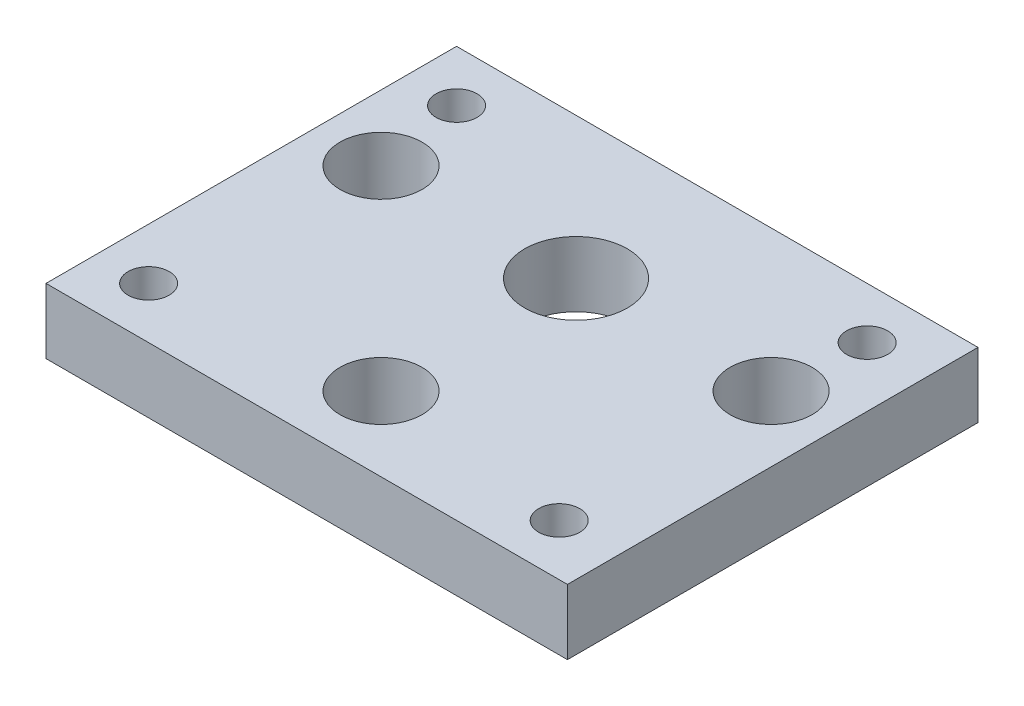
ISO-10303-21;
HEADER;
FILE_DESCRIPTION(('STEP AP214'),'2;1');
FILE_NAME('part.step','',(''),(''),'','','');
FILE_SCHEMA(('AUTOMOTIVE_DESIGN { 1 0 10303 214 1 1 1 1 }'));
ENDSEC;
DATA;
#1=APPLICATION_CONTEXT('core data for automotive mechanical design processes');
#2=APPLICATION_PROTOCOL_DEFINITION('international standard','automotive_design',2000,#1);
#3=PRODUCT_CONTEXT('',#1,'mechanical');
#4=PRODUCT('Part','Part','',(#3));
#5=PRODUCT_RELATED_PRODUCT_CATEGORY('part','',(#4));
#6=PRODUCT_DEFINITION_FORMATION('','',#4);
#7=PRODUCT_DEFINITION_CONTEXT('part definition',#1,'design');
#8=PRODUCT_DEFINITION('design','',#6,#7);
#9=PRODUCT_DEFINITION_SHAPE('','',#8);
#10=(LENGTH_UNIT() NAMED_UNIT(*) SI_UNIT(.MILLI.,.METRE.));
#11=(NAMED_UNIT(*) PLANE_ANGLE_UNIT() SI_UNIT($,.RADIAN.));
#12=(NAMED_UNIT(*) SI_UNIT($,.STERADIAN.) SOLID_ANGLE_UNIT());
#13=UNCERTAINTY_MEASURE_WITH_UNIT(LENGTH_MEASURE(1.E-05),#10,'distance_accuracy_value','');
#14=(GEOMETRIC_REPRESENTATION_CONTEXT(3) GLOBAL_UNCERTAINTY_ASSIGNED_CONTEXT((#13)) GLOBAL_UNIT_ASSIGNED_CONTEXT((#10,
#11,#12)) REPRESENTATION_CONTEXT('',''));
#15=CARTESIAN_POINT('',(0.,0.,0.));
#16=DIRECTION('',(0.,0.,1.));
#17=DIRECTION('',(1.,0.,0.));
#18=AXIS2_PLACEMENT_3D('',#15,#16,#17);
#19=CARTESIAN_POINT('',(25.4,6.35,-40.));
#20=DIRECTION('',(-1.,0.,0.));
#21=DIRECTION('',(0.,0.,1.));
#22=AXIS2_PLACEMENT_3D('',#19,#20,#21);
#23=PLANE('',#22);
#24=DIRECTION('',(0.,-1.,0.));
#25=VECTOR('',#24,1.);
#26=CARTESIAN_POINT('',(25.4,10.,-33.2265724491529));
#27=LINE('',#26,#25);
#28=CARTESIAN_POINT('',(25.4,6.35,-33.2265724491529));
#29=VERTEX_POINT('',#28);
#30=CARTESIAN_POINT('',(25.4,0.,-33.2265724491529));
#31=VERTEX_POINT('',#30);
#32=EDGE_CURVE('E49',#29,#31,#27,.T.);
#33=ORIENTED_EDGE('',*,*,#32,.F.);
#34=DIRECTION('',(0.,0.,-1.));
#35=VECTOR('',#34,1.);
#36=CARTESIAN_POINT('',(25.4,6.35,-40.));
#37=LINE('',#36,#35);
#38=CARTESIAN_POINT('',(25.4,6.35,6.77342755084709));
#39=VERTEX_POINT('',#38);
#40=EDGE_CURVE('E87',#39,#29,#37,.T.);
#41=ORIENTED_EDGE('',*,*,#40,.F.);
#42=DIRECTION('',(0.,1.,0.));
#43=VECTOR('',#42,1.);
#44=CARTESIAN_POINT('',(25.4,-3.65,6.77342755084709));
#45=LINE('',#44,#43);
#46=CARTESIAN_POINT('',(25.4,0.,6.77342755084709));
#47=VERTEX_POINT('',#46);
#48=EDGE_CURVE('E113',#47,#39,#45,.T.);
#49=ORIENTED_EDGE('',*,*,#48,.F.);
#50=DIRECTION('',(0.,0.,-1.));
#51=VECTOR('',#50,1.);
#52=CARTESIAN_POINT('',(25.4,0.,-40.));
#53=LINE('',#52,#51);
#54=EDGE_CURVE('E88',#47,#31,#53,.T.);
#55=ORIENTED_EDGE('',*,*,#54,.T.);
#56=EDGE_LOOP('',(#33,#41,#49,#55));
#57=FACE_BOUND('',#56,.T.);
#58=ADVANCED_FACE('F35',(#57),#23,.F.);
#59=CARTESIAN_POINT('',(-25.4,6.35,-40.));
#60=DIRECTION('',(1.,0.,0.));
#61=DIRECTION('',(0.,0.,-1.));
#62=AXIS2_PLACEMENT_3D('',#59,#60,#61);
#63=PLANE('',#62);
#64=DIRECTION('',(0.,-1.,0.));
#65=VECTOR('',#64,1.);
#66=CARTESIAN_POINT('',(-25.4,10.,-33.2265724491529));
#67=LINE('',#66,#65);
#68=CARTESIAN_POINT('',(-25.4,6.35,-33.2265724491529));
#69=VERTEX_POINT('',#68);
#70=CARTESIAN_POINT('',(-25.4,0.,-33.2265724491529));
#71=VERTEX_POINT('',#70);
#72=EDGE_CURVE('E76',#69,#71,#67,.T.);
#73=ORIENTED_EDGE('',*,*,#72,.T.);
#74=DIRECTION('',(0.,0.,1.));
#75=VECTOR('',#74,1.);
#76=CARTESIAN_POINT('',(-25.4,0.,-40.));
#77=LINE('',#76,#75);
#78=CARTESIAN_POINT('',(-25.4,0.,6.77342755084709));
#79=VERTEX_POINT('',#78);
#80=EDGE_CURVE('E57',#71,#79,#77,.T.);
#81=ORIENTED_EDGE('',*,*,#80,.T.);
#82=DIRECTION('',(0.,1.,0.));
#83=VECTOR('',#82,1.);
#84=CARTESIAN_POINT('',(-25.4,-3.65,6.77342755084709));
#85=LINE('',#84,#83);
#86=CARTESIAN_POINT('',(-25.4,6.35,6.77342755084709));
#87=VERTEX_POINT('',#86);
#88=EDGE_CURVE('E105',#79,#87,#85,.T.);
#89=ORIENTED_EDGE('',*,*,#88,.T.);
#90=DIRECTION('',(0.,0.,1.));
#91=VECTOR('',#90,1.);
#92=CARTESIAN_POINT('',(-25.4,6.35,-40.));
#93=LINE('',#92,#91);
#94=EDGE_CURVE('E42',#69,#87,#93,.T.);
#95=ORIENTED_EDGE('',*,*,#94,.F.);
#96=EDGE_LOOP('',(#73,#81,#89,#95));
#97=FACE_BOUND('',#96,.T.);
#98=ADVANCED_FACE('F84',(#97),#63,.F.);
#99=CARTESIAN_POINT('',(0.,6.35,0.));
#100=DIRECTION('',(0.,1.,0.));
#101=DIRECTION('',(0.,0.,1.));
#102=AXIS2_PLACEMENT_3D('',#99,#100,#101);
#103=PLANE('',#102);
#104=CARTESIAN_POINT('',(19.6,6.35,1.77342755084709));
#105=DIRECTION('',(0.,1.,0.));
#106=DIRECTION('',(0.,0.,1.));
#107=AXIS2_PLACEMENT_3D('',#104,#105,#106);
#108=CIRCLE('',#107,2.);
#109=CARTESIAN_POINT('',(19.6,6.35,3.77342755084709));
#110=VERTEX_POINT('',#109);
#111=EDGE_CURVE('E133',#110,#110,#108,.T.);
#112=ORIENTED_EDGE('',*,*,#111,.F.);
#113=EDGE_LOOP('',(#112));
#114=FACE_BOUND('',#113,.T.);
#115=CARTESIAN_POINT('',(19.6000000000003,6.35,-28.2265724491529));
#116=DIRECTION('',(0.,1.,0.));
#117=DIRECTION('',(0.,0.,1.));
#118=AXIS2_PLACEMENT_3D('',#115,#116,#117);
#119=CIRCLE('',#118,2.);
#120=CARTESIAN_POINT('',(19.6000000000003,6.35,-26.2265724491529));
#121=VERTEX_POINT('',#120);
#122=EDGE_CURVE('E136',#121,#121,#119,.T.);
#123=ORIENTED_EDGE('',*,*,#122,.F.);
#124=EDGE_LOOP('',(#123));
#125=FACE_BOUND('',#124,.T.);
#126=CARTESIAN_POINT('',(-20.3999999999997,6.35,-28.2265724491529));
#127=DIRECTION('',(0.,1.,0.));
#128=DIRECTION('',(0.,0.,1.));
#129=AXIS2_PLACEMENT_3D('',#126,#127,#128);
#130=CIRCLE('',#129,2.);
#131=CARTESIAN_POINT('',(-20.3999999999997,6.35,-26.2265724491529));
#132=VERTEX_POINT('',#131);
#133=EDGE_CURVE('E139',#132,#132,#130,.T.);
#134=ORIENTED_EDGE('',*,*,#133,.F.);
#135=EDGE_LOOP('',(#134));
#136=FACE_BOUND('',#135,.T.);
#137=CARTESIAN_POINT('',(-20.4,6.35,1.77342755084709));
#138=DIRECTION('',(0.,1.,0.));
#139=DIRECTION('',(0.,0.,1.));
#140=AXIS2_PLACEMENT_3D('',#137,#138,#139);
#141=CIRCLE('',#140,2.);
#142=CARTESIAN_POINT('',(-20.4,6.35,3.77342755084709));
#143=VERTEX_POINT('',#142);
#144=EDGE_CURVE('E127',#143,#143,#141,.T.);
#145=ORIENTED_EDGE('',*,*,#144,.F.);
#146=EDGE_LOOP('',(#145));
#147=FACE_BOUND('',#146,.T.);
#148=CARTESIAN_POINT('',(0.,6.35,-19.4660918494586));
#149=DIRECTION('',(0.,1.,0.));
#150=DIRECTION('',(0.,0.,1.));
#151=AXIS2_PLACEMENT_3D('',#148,#149,#150);
#152=CIRCLE('',#151,5.);
#153=CARTESIAN_POINT('',(0.,6.35,-14.4660918494586));
#154=VERTEX_POINT('',#153);
#155=EDGE_CURVE('E81',#154,#154,#152,.T.);
#156=ORIENTED_EDGE('',*,*,#155,.F.);
#157=EDGE_LOOP('',(#156));
#158=FACE_BOUND('',#157,.T.);
#159=CARTESIAN_POINT('',(19.,6.35,-19.4660918494586));
#160=DIRECTION('',(0.,1.,0.));
#161=DIRECTION('',(0.,0.,1.));
#162=AXIS2_PLACEMENT_3D('',#159,#160,#161);
#163=CIRCLE('',#162,4.);
#164=CARTESIAN_POINT('',(19.,6.35,-15.4660918494586));
#165=VERTEX_POINT('',#164);
#166=EDGE_CURVE('E108',#165,#165,#163,.T.);
#167=ORIENTED_EDGE('',*,*,#166,.F.);
#168=EDGE_LOOP('',(#167));
#169=FACE_BOUND('',#168,.T.);
#170=CARTESIAN_POINT('',(0.,6.35,-0.466091849458573));
#171=DIRECTION('',(0.,1.,0.));
#172=DIRECTION('',(0.,0.,1.));
#173=AXIS2_PLACEMENT_3D('',#170,#171,#172);
#174=CIRCLE('',#173,4.);
#175=CARTESIAN_POINT('',(0.,6.35,3.53390815054143));
#176=VERTEX_POINT('',#175);
#177=EDGE_CURVE('E101',#176,#176,#174,.T.);
#178=ORIENTED_EDGE('',*,*,#177,.F.);
#179=EDGE_LOOP('',(#178));
#180=FACE_BOUND('',#179,.T.);
#181=CARTESIAN_POINT('',(-19.,6.35,-19.4660918494586));
#182=DIRECTION('',(0.,1.,0.));
#183=DIRECTION('',(0.,0.,1.));
#184=AXIS2_PLACEMENT_3D('',#181,#182,#183);
#185=CIRCLE('',#184,4.);
#186=CARTESIAN_POINT('',(-19.,6.35,-15.4660918494586));
#187=VERTEX_POINT('',#186);
#188=EDGE_CURVE('E95',#187,#187,#185,.T.);
#189=ORIENTED_EDGE('',*,*,#188,.F.);
#190=EDGE_LOOP('',(#189));
#191=FACE_BOUND('',#190,.T.);
#192=ORIENTED_EDGE('',*,*,#40,.T.);
#193=DIRECTION('',(-1.,0.,0.));
#194=VECTOR('',#193,1.);
#195=CARTESIAN_POINT('',(0.,6.35,-33.2265724491529));
#196=LINE('',#195,#194);
#197=EDGE_CURVE('E119',#29,#69,#196,.T.);
#198=ORIENTED_EDGE('',*,*,#197,.T.);
#199=ORIENTED_EDGE('',*,*,#94,.T.);
#200=DIRECTION('',(-1.,0.,0.));
#201=VECTOR('',#200,1.);
#202=CARTESIAN_POINT('',(-25.4,6.35,6.77342755084709));
#203=LINE('',#202,#201);
#204=EDGE_CURVE('E115',#39,#87,#203,.T.);
#205=ORIENTED_EDGE('',*,*,#204,.F.);
#206=EDGE_LOOP('',(#192,#198,#199,#205));
#207=FACE_BOUND('',#206,.T.);
#208=ADVANCED_FACE('F157',(#114,#125,#136,#147,#158,#169,#180,#191,#207),#103,.T.);
#209=CARTESIAN_POINT('',(0.,0.,0.));
#210=DIRECTION('',(0.,1.,0.));
#211=DIRECTION('',(0.,0.,1.));
#212=AXIS2_PLACEMENT_3D('',#209,#210,#211);
#213=PLANE('',#212);
#214=CARTESIAN_POINT('',(19.6,0.,1.77342755084709));
#215=DIRECTION('',(0.,-1.,0.));
#216=DIRECTION('',(0.,0.,-1.));
#217=AXIS2_PLACEMENT_3D('',#214,#215,#216);
#218=CIRCLE('',#217,2.);
#219=CARTESIAN_POINT('',(19.6,0.,-0.226572449152912));
#220=VERTEX_POINT('',#219);
#221=EDGE_CURVE('E142',#220,#220,#218,.T.);
#222=ORIENTED_EDGE('',*,*,#221,.F.);
#223=EDGE_LOOP('',(#222));
#224=FACE_BOUND('',#223,.T.);
#225=CARTESIAN_POINT('',(19.6000000000003,0.,-28.2265724491529));
#226=DIRECTION('',(0.,-1.,0.));
#227=DIRECTION('',(0.,0.,-1.));
#228=AXIS2_PLACEMENT_3D('',#225,#226,#227);
#229=CIRCLE('',#228,2.);
#230=CARTESIAN_POINT('',(19.6000000000003,0.,-30.2265724491529));
#231=VERTEX_POINT('',#230);
#232=EDGE_CURVE('E146',#231,#231,#229,.T.);
#233=ORIENTED_EDGE('',*,*,#232,.F.);
#234=EDGE_LOOP('',(#233));
#235=FACE_BOUND('',#234,.T.);
#236=CARTESIAN_POINT('',(-20.3999999999997,0.,-28.2265724491529));
#237=DIRECTION('',(0.,-1.,0.));
#238=DIRECTION('',(0.,0.,-1.));
#239=AXIS2_PLACEMENT_3D('',#236,#237,#238);
#240=CIRCLE('',#239,2.);
#241=CARTESIAN_POINT('',(-20.3999999999997,0.,-30.2265724491529));
#242=VERTEX_POINT('',#241);
#243=EDGE_CURVE('E143',#242,#242,#240,.T.);
#244=ORIENTED_EDGE('',*,*,#243,.F.);
#245=EDGE_LOOP('',(#244));
#246=FACE_BOUND('',#245,.T.);
#247=CARTESIAN_POINT('',(-20.4,0.,1.77342755084709));
#248=DIRECTION('',(0.,-1.,0.));
#249=DIRECTION('',(0.,0.,-1.));
#250=AXIS2_PLACEMENT_3D('',#247,#248,#249);
#251=CIRCLE('',#250,2.);
#252=CARTESIAN_POINT('',(-20.4,0.,-0.226572449152912));
#253=VERTEX_POINT('',#252);
#254=EDGE_CURVE('E130',#253,#253,#251,.T.);
#255=ORIENTED_EDGE('',*,*,#254,.F.);
#256=EDGE_LOOP('',(#255));
#257=FACE_BOUND('',#256,.T.);
#258=CARTESIAN_POINT('',(0.,0.,-19.4660918494586));
#259=DIRECTION('',(0.,-1.,0.));
#260=DIRECTION('',(0.,0.,-1.));
#261=AXIS2_PLACEMENT_3D('',#258,#259,#260);
#262=CIRCLE('',#261,5.);
#263=CARTESIAN_POINT('',(0.,0.,-24.4660918494586));
#264=VERTEX_POINT('',#263);
#265=EDGE_CURVE('E124',#264,#264,#262,.T.);
#266=ORIENTED_EDGE('',*,*,#265,.F.);
#267=EDGE_LOOP('',(#266));
#268=FACE_BOUND('',#267,.T.);
#269=CARTESIAN_POINT('',(-19.,0.,-19.4660918494586));
#270=DIRECTION('',(0.,1.,0.));
#271=DIRECTION('',(0.,0.,1.));
#272=AXIS2_PLACEMENT_3D('',#269,#270,#271);
#273=CIRCLE('',#272,4.);
#274=CARTESIAN_POINT('',(-19.,0.,-15.4660918494586));
#275=VERTEX_POINT('',#274);
#276=EDGE_CURVE('E91',#275,#275,#273,.T.);
#277=ORIENTED_EDGE('',*,*,#276,.T.);
#278=EDGE_LOOP('',(#277));
#279=FACE_BOUND('',#278,.T.);
#280=CARTESIAN_POINT('',(0.,0.,-0.466091849458573));
#281=DIRECTION('',(0.,1.,0.));
#282=DIRECTION('',(0.,0.,1.));
#283=AXIS2_PLACEMENT_3D('',#280,#281,#282);
#284=CIRCLE('',#283,4.);
#285=CARTESIAN_POINT('',(0.,0.,3.53390815054143));
#286=VERTEX_POINT('',#285);
#287=EDGE_CURVE('E104',#286,#286,#284,.T.);
#288=ORIENTED_EDGE('',*,*,#287,.T.);
#289=EDGE_LOOP('',(#288));
#290=FACE_BOUND('',#289,.T.);
#291=CARTESIAN_POINT('',(19.,0.,-19.4660918494586));
#292=DIRECTION('',(0.,1.,0.));
#293=DIRECTION('',(0.,0.,1.));
#294=AXIS2_PLACEMENT_3D('',#291,#292,#293);
#295=CIRCLE('',#294,4.);
#296=CARTESIAN_POINT('',(19.,0.,-15.4660918494586));
#297=VERTEX_POINT('',#296);
#298=EDGE_CURVE('E98',#297,#297,#295,.T.);
#299=ORIENTED_EDGE('',*,*,#298,.T.);
#300=EDGE_LOOP('',(#299));
#301=FACE_BOUND('',#300,.T.);
#302=DIRECTION('',(1.,0.,0.));
#303=VECTOR('',#302,1.);
#304=CARTESIAN_POINT('',(0.,0.,-33.2265724491529));
#305=LINE('',#304,#303);
#306=EDGE_CURVE('E74',#71,#31,#305,.T.);
#307=ORIENTED_EDGE('',*,*,#306,.T.);
#308=ORIENTED_EDGE('',*,*,#54,.F.);
#309=DIRECTION('',(-1.,0.,0.));
#310=VECTOR('',#309,1.);
#311=CARTESIAN_POINT('',(0.,0.,6.77342755084709));
#312=LINE('',#311,#310);
#313=EDGE_CURVE('E11',#47,#79,#312,.T.);
#314=ORIENTED_EDGE('',*,*,#313,.T.);
#315=ORIENTED_EDGE('',*,*,#80,.F.);
#316=EDGE_LOOP('',(#307,#308,#314,#315));
#317=FACE_BOUND('',#316,.T.);
#318=ADVANCED_FACE('F86',(#224,#235,#246,#257,#268,#279,#290,#301,#317),#213,.F.);
#319=CARTESIAN_POINT('',(-19.,0.,-19.4660918494586));
#320=DIRECTION('',(0.,1.,0.));
#321=DIRECTION('',(0.,0.,1.));
#322=AXIS2_PLACEMENT_3D('',#319,#320,#321);
#323=CYLINDRICAL_SURFACE('',#322,4.);
#324=ORIENTED_EDGE('',*,*,#276,.F.);
#325=EDGE_LOOP('',(#324));
#326=FACE_BOUND('',#325,.T.);
#327=ORIENTED_EDGE('',*,*,#188,.T.);
#328=EDGE_LOOP('',(#327));
#329=FACE_BOUND('',#328,.T.);
#330=ADVANCED_FACE('F156',(#326,#329),#323,.F.);
#331=CARTESIAN_POINT('',(0.,0.,-0.466091849458573));
#332=DIRECTION('',(0.,1.,0.));
#333=DIRECTION('',(0.,0.,1.));
#334=AXIS2_PLACEMENT_3D('',#331,#332,#333);
#335=CYLINDRICAL_SURFACE('',#334,4.);
#336=ORIENTED_EDGE('',*,*,#287,.F.);
#337=EDGE_LOOP('',(#336));
#338=FACE_BOUND('',#337,.T.);
#339=ORIENTED_EDGE('',*,*,#177,.T.);
#340=EDGE_LOOP('',(#339));
#341=FACE_BOUND('',#340,.T.);
#342=ADVANCED_FACE('F177',(#338,#341),#335,.F.);
#343=CARTESIAN_POINT('',(19.,0.,-19.4660918494586));
#344=DIRECTION('',(0.,1.,0.));
#345=DIRECTION('',(0.,0.,1.));
#346=AXIS2_PLACEMENT_3D('',#343,#344,#345);
#347=CYLINDRICAL_SURFACE('',#346,4.);
#348=ORIENTED_EDGE('',*,*,#298,.F.);
#349=EDGE_LOOP('',(#348));
#350=FACE_BOUND('',#349,.T.);
#351=ORIENTED_EDGE('',*,*,#166,.T.);
#352=EDGE_LOOP('',(#351));
#353=FACE_BOUND('',#352,.T.);
#354=ADVANCED_FACE('F173',(#350,#353),#347,.F.);
#355=CARTESIAN_POINT('',(-25.4,-3.65,6.77342755084709));
#356=DIRECTION('',(0.,0.,-1.));
#357=DIRECTION('',(-1.,0.,0.));
#358=AXIS2_PLACEMENT_3D('',#355,#356,#357);
#359=PLANE('',#358);
#360=ORIENTED_EDGE('',*,*,#48,.T.);
#361=ORIENTED_EDGE('',*,*,#204,.T.);
#362=ORIENTED_EDGE('',*,*,#88,.F.);
#363=ORIENTED_EDGE('',*,*,#313,.F.);
#364=EDGE_LOOP('',(#360,#361,#362,#363));
#365=FACE_BOUND('',#364,.T.);
#366=ADVANCED_FACE('F176',(#365),#359,.F.);
#367=CARTESIAN_POINT('',(0.,10.,-33.2265724491529));
#368=DIRECTION('',(0.,0.,-1.));
#369=DIRECTION('',(-1.,0.,0.));
#370=AXIS2_PLACEMENT_3D('',#367,#368,#369);
#371=PLANE('',#370);
#372=ORIENTED_EDGE('',*,*,#32,.T.);
#373=ORIENTED_EDGE('',*,*,#306,.F.);
#374=ORIENTED_EDGE('',*,*,#72,.F.);
#375=ORIENTED_EDGE('',*,*,#197,.F.);
#376=EDGE_LOOP('',(#372,#373,#374,#375));
#377=FACE_BOUND('',#376,.T.);
#378=ADVANCED_FACE('F75',(#377),#371,.T.);
#379=CARTESIAN_POINT('',(0.,10.,-19.4660918494586));
#380=DIRECTION('',(0.,-1.,0.));
#381=DIRECTION('',(0.,0.,-1.));
#382=AXIS2_PLACEMENT_3D('',#379,#380,#381);
#383=CYLINDRICAL_SURFACE('',#382,5.);
#384=ORIENTED_EDGE('',*,*,#155,.T.);
#385=EDGE_LOOP('',(#384));
#386=FACE_BOUND('',#385,.T.);
#387=ORIENTED_EDGE('',*,*,#265,.T.);
#388=EDGE_LOOP('',(#387));
#389=FACE_BOUND('',#388,.T.);
#390=ADVANCED_FACE('F199',(#386,#389),#383,.F.);
#391=CARTESIAN_POINT('',(-20.4,10.,1.77342755084709));
#392=DIRECTION('',(0.,-1.,0.));
#393=DIRECTION('',(0.,0.,-1.));
#394=AXIS2_PLACEMENT_3D('',#391,#392,#393);
#395=CYLINDRICAL_SURFACE('',#394,2.);
#396=ORIENTED_EDGE('',*,*,#144,.T.);
#397=EDGE_LOOP('',(#396));
#398=FACE_BOUND('',#397,.T.);
#399=ORIENTED_EDGE('',*,*,#254,.T.);
#400=EDGE_LOOP('',(#399));
#401=FACE_BOUND('',#400,.T.);
#402=ADVANCED_FACE('F256',(#398,#401),#395,.F.);
#403=CARTESIAN_POINT('',(-20.3999999999997,10.,-28.2265724491529));
#404=DIRECTION('',(0.,-1.,0.));
#405=DIRECTION('',(0.,0.,-1.));
#406=AXIS2_PLACEMENT_3D('',#403,#404,#405);
#407=CYLINDRICAL_SURFACE('',#406,2.);
#408=ORIENTED_EDGE('',*,*,#133,.T.);
#409=EDGE_LOOP('',(#408));
#410=FACE_BOUND('',#409,.T.);
#411=ORIENTED_EDGE('',*,*,#243,.T.);
#412=EDGE_LOOP('',(#411));
#413=FACE_BOUND('',#412,.T.);
#414=ADVANCED_FACE('F277',(#410,#413),#407,.F.);
#415=CARTESIAN_POINT('',(19.6000000000003,10.,-28.2265724491529));
#416=DIRECTION('',(0.,-1.,0.));
#417=DIRECTION('',(0.,0.,-1.));
#418=AXIS2_PLACEMENT_3D('',#415,#416,#417);
#419=CYLINDRICAL_SURFACE('',#418,2.);
#420=ORIENTED_EDGE('',*,*,#122,.T.);
#421=EDGE_LOOP('',(#420));
#422=FACE_BOUND('',#421,.T.);
#423=ORIENTED_EDGE('',*,*,#232,.T.);
#424=EDGE_LOOP('',(#423));
#425=FACE_BOUND('',#424,.T.);
#426=ADVANCED_FACE('F287',(#422,#425),#419,.F.);
#427=CARTESIAN_POINT('',(19.6,10.,1.77342755084709));
#428=DIRECTION('',(0.,-1.,0.));
#429=DIRECTION('',(0.,0.,-1.));
#430=AXIS2_PLACEMENT_3D('',#427,#428,#429);
#431=CYLINDRICAL_SURFACE('',#430,2.);
#432=ORIENTED_EDGE('',*,*,#111,.T.);
#433=EDGE_LOOP('',(#432));
#434=FACE_BOUND('',#433,.T.);
#435=ORIENTED_EDGE('',*,*,#221,.T.);
#436=EDGE_LOOP('',(#435));
#437=FACE_BOUND('',#436,.T.);
#438=ADVANCED_FACE('F152',(#434,#437),#431,.F.);
#439=CLOSED_SHELL('',(#58,#98,#208,#318,#330,#342,#354,#366,#378,#390,#402,#414,#426,#438));
#440=MANIFOLD_SOLID_BREP('B2',#439);
#441=ADVANCED_BREP_SHAPE_REPRESENTATION('',(#18,#440),#14);
#442=SHAPE_DEFINITION_REPRESENTATION(#9,#441);
ENDSEC;
END-ISO-10303-21;
